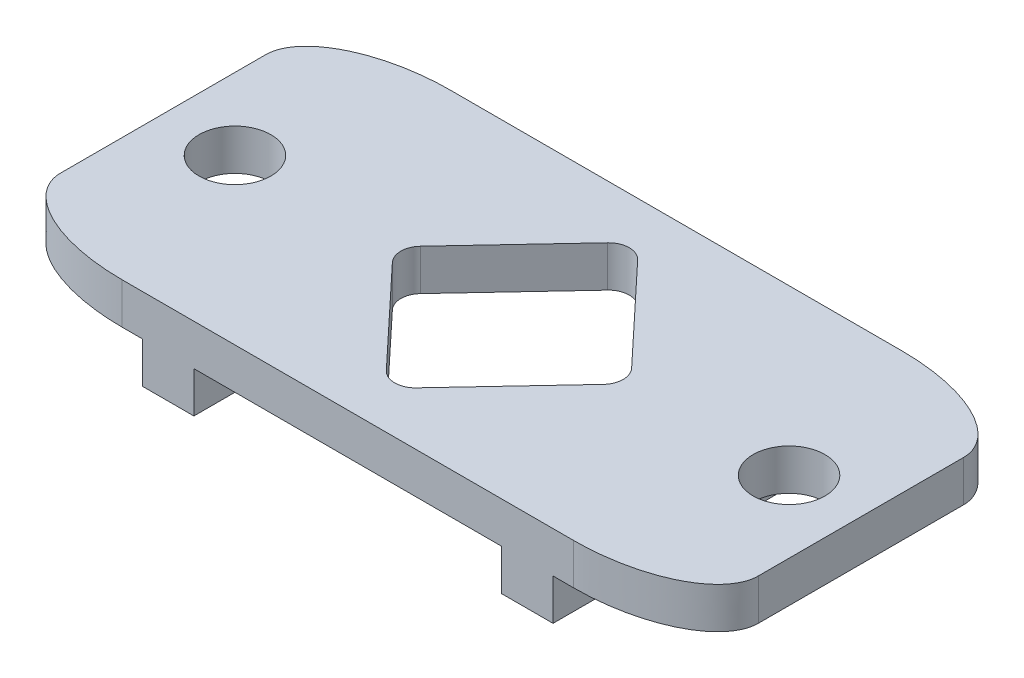
ISO-10303-21;
HEADER;
FILE_DESCRIPTION(('STEP AP214'),'2;1');
FILE_NAME('part.step','',(''),(''),'','','');
FILE_SCHEMA(('AUTOMOTIVE_DESIGN { 1 0 10303 214 1 1 1 1 }'));
ENDSEC;
DATA;
#1=APPLICATION_CONTEXT('core data for automotive mechanical design processes');
#2=APPLICATION_PROTOCOL_DEFINITION('international standard','automotive_design',2000,#1);
#3=PRODUCT_CONTEXT('',#1,'mechanical');
#4=PRODUCT('Part','Part','',(#3));
#5=PRODUCT_RELATED_PRODUCT_CATEGORY('part','',(#4));
#6=PRODUCT_DEFINITION_FORMATION('','',#4);
#7=PRODUCT_DEFINITION_CONTEXT('part definition',#1,'design');
#8=PRODUCT_DEFINITION('design','',#6,#7);
#9=PRODUCT_DEFINITION_SHAPE('','',#8);
#10=(LENGTH_UNIT() NAMED_UNIT(*) SI_UNIT(.MILLI.,.METRE.));
#11=(NAMED_UNIT(*) PLANE_ANGLE_UNIT() SI_UNIT($,.RADIAN.));
#12=(NAMED_UNIT(*) SI_UNIT($,.STERADIAN.) SOLID_ANGLE_UNIT());
#13=UNCERTAINTY_MEASURE_WITH_UNIT(LENGTH_MEASURE(1.E-05),#10,'distance_accuracy_value','');
#14=(GEOMETRIC_REPRESENTATION_CONTEXT(3) GLOBAL_UNCERTAINTY_ASSIGNED_CONTEXT((#13)) GLOBAL_UNIT_ASSIGNED_CONTEXT((#10,
#11,#12)) REPRESENTATION_CONTEXT('',''));
#15=CARTESIAN_POINT('',(0.,0.,0.));
#16=DIRECTION('',(0.,0.,1.));
#17=DIRECTION('',(1.,0.,0.));
#18=AXIS2_PLACEMENT_3D('',#15,#16,#17);
#19=CARTESIAN_POINT('',(0.,2.,0.));
#20=DIRECTION('',(0.,-1.,0.));
#21=DIRECTION('',(0.,0.,-1.));
#22=AXIS2_PLACEMENT_3D('',#19,#20,#21);
#23=PLANE('',#22);
#24=CARTESIAN_POINT('',(-13.5,2.,0.));
#25=DIRECTION('',(0.,1.,0.));
#26=DIRECTION('',(0.,0.,1.));
#27=AXIS2_PLACEMENT_3D('',#24,#25,#26);
#28=CIRCLE('',#27,1.75);
#29=CARTESIAN_POINT('',(-13.5,2.,1.75));
#30=VERTEX_POINT('',#29);
#31=EDGE_CURVE('E367',#30,#30,#28,.T.);
#32=ORIENTED_EDGE('',*,*,#31,.F.);
#33=EDGE_LOOP('',(#32));
#34=FACE_BOUND('',#33,.T.);
#35=DIRECTION('',(0.,0.,-1.));
#36=VECTOR('',#35,1.);
#37=CARTESIAN_POINT('',(17.,2.,8.));
#38=LINE('',#37,#36);
#39=CARTESIAN_POINT('',(17.,2.,5.));
#40=VERTEX_POINT('',#39);
#41=CARTESIAN_POINT('',(17.,2.,-5.));
#42=VERTEX_POINT('',#41);
#43=EDGE_CURVE('E625',#40,#42,#38,.T.);
#44=ORIENTED_EDGE('',*,*,#43,.T.);
#45=CARTESIAN_POINT('',(11.,2.,-8.));
#46=CARTESIAN_POINT('',(17.,2.,-8.));
#47=CARTESIAN_POINT('',(17.,2.,-5.));
#48=(BOUNDED_CURVE() B_SPLINE_CURVE(2,(#45,#46,#47),.UNSPECIFIED.,.F.,
.F.) B_SPLINE_CURVE_WITH_KNOTS((3,3),(0.,1.),
.UNSPECIFIED.) CURVE() GEOMETRIC_REPRESENTATION_ITEM() RATIONAL_B_SPLINE_CURVE((1.,
0.707106781186548,1.)) REPRESENTATION_ITEM(''));
#49=CARTESIAN_POINT('',(11.,2.,-8.));
#50=VERTEX_POINT('',#49);
#51=EDGE_CURVE('E711',#42,#50,#48,.F.);
#52=ORIENTED_EDGE('',*,*,#51,.T.);
#53=DIRECTION('',(1.,0.,0.));
#54=VECTOR('',#53,1.);
#55=CARTESIAN_POINT('',(-17.,2.,-8.));
#56=LINE('',#55,#54);
#57=CARTESIAN_POINT('',(-11.,2.,-8.));
#58=VERTEX_POINT('',#57);
#59=EDGE_CURVE('E381',#58,#50,#56,.T.);
#60=ORIENTED_EDGE('',*,*,#59,.F.);
#61=CARTESIAN_POINT('',(-17.,2.,-5.));
#62=CARTESIAN_POINT('',(-17.,2.,-8.));
#63=CARTESIAN_POINT('',(-11.,2.,-8.));
#64=(BOUNDED_CURVE() B_SPLINE_CURVE(2,(#61,#62,#63),.UNSPECIFIED.,.F.,
.F.) B_SPLINE_CURVE_WITH_KNOTS((3,3),(0.,1.),
.UNSPECIFIED.) CURVE() GEOMETRIC_REPRESENTATION_ITEM() RATIONAL_B_SPLINE_CURVE((1.,
0.707106781186548,1.)) REPRESENTATION_ITEM(''));
#65=CARTESIAN_POINT('',(-17.,2.,-5.));
#66=VERTEX_POINT('',#65);
#67=EDGE_CURVE('E564',#58,#66,#64,.F.);
#68=ORIENTED_EDGE('',*,*,#67,.T.);
#69=DIRECTION('',(0.,0.,-1.));
#70=VECTOR('',#69,1.);
#71=CARTESIAN_POINT('',(-17.,2.,8.));
#72=LINE('',#71,#70);
#73=CARTESIAN_POINT('',(-17.,2.,5.));
#74=VERTEX_POINT('',#73);
#75=EDGE_CURVE('E378',#74,#66,#72,.T.);
#76=ORIENTED_EDGE('',*,*,#75,.F.);
#77=CARTESIAN_POINT('',(-11.,2.,8.));
#78=CARTESIAN_POINT('',(-17.,2.,8.));
#79=CARTESIAN_POINT('',(-17.,2.,5.));
#80=(BOUNDED_CURVE() B_SPLINE_CURVE(2,(#77,#78,#79),.UNSPECIFIED.,.F.,
.F.) B_SPLINE_CURVE_WITH_KNOTS((3,3),(0.,1.),
.UNSPECIFIED.) CURVE() GEOMETRIC_REPRESENTATION_ITEM() RATIONAL_B_SPLINE_CURVE((1.,
0.707106781186548,1.)) REPRESENTATION_ITEM(''));
#81=CARTESIAN_POINT('',(-11.,2.,8.));
#82=VERTEX_POINT('',#81);
#83=EDGE_CURVE('E390',#74,#82,#80,.F.);
#84=ORIENTED_EDGE('',*,*,#83,.T.);
#85=DIRECTION('',(1.,0.,0.));
#86=VECTOR('',#85,1.);
#87=CARTESIAN_POINT('',(-17.,2.,8.));
#88=LINE('',#87,#86);
#89=CARTESIAN_POINT('',(11.,2.,8.));
#90=VERTEX_POINT('',#89);
#91=EDGE_CURVE('E383',#82,#90,#88,.T.);
#92=ORIENTED_EDGE('',*,*,#91,.T.);
#93=CARTESIAN_POINT('',(17.,2.,5.));
#94=CARTESIAN_POINT('',(17.,2.,8.));
#95=CARTESIAN_POINT('',(11.,2.,8.));
#96=(BOUNDED_CURVE() B_SPLINE_CURVE(2,(#93,#94,#95),.UNSPECIFIED.,.F.,
.F.) B_SPLINE_CURVE_WITH_KNOTS((3,3),(0.,1.),
.UNSPECIFIED.) CURVE() GEOMETRIC_REPRESENTATION_ITEM() RATIONAL_B_SPLINE_CURVE((1.,
0.707106781186548,1.)) REPRESENTATION_ITEM(''));
#97=EDGE_CURVE('E569',#90,#40,#96,.F.);
#98=ORIENTED_EDGE('',*,*,#97,.T.);
#99=EDGE_LOOP('',(#44,#52,#60,#68,#76,#84,#92,#98));
#100=FACE_BOUND('',#99,.T.);
#101=CARTESIAN_POINT('',(13.5,2.,0.));
#102=DIRECTION('',(0.,1.,0.));
#103=DIRECTION('',(0.,0.,1.));
#104=AXIS2_PLACEMENT_3D('',#101,#102,#103);
#105=CIRCLE('',#104,1.75);
#106=CARTESIAN_POINT('',(13.5,2.,1.74999999999999));
#107=VERTEX_POINT('',#106);
#108=EDGE_CURVE('E361',#107,#107,#105,.F.);
#109=ORIENTED_EDGE('',*,*,#108,.T.);
#110=EDGE_LOOP('',(#109));
#111=FACE_BOUND('',#110,.T.);
#112=CARTESIAN_POINT('',(-4.41585297195076,2.,0.));
#113=DIRECTION('',(0.,-1.,0.));
#114=DIRECTION('',(0.,0.,-1.));
#115=AXIS2_PLACEMENT_3D('',#112,#113,#114);
#116=CIRCLE('',#115,1.);
#117=CARTESIAN_POINT('',(-5.14539017609084,2.,-0.683941128881335));
#118=VERTEX_POINT('',#117);
#119=CARTESIAN_POINT('',(-5.14539017609084,2.,0.683941128881334));
#120=VERTEX_POINT('',#119);
#121=EDGE_CURVE('E238',#118,#120,#116,.F.);
#122=ORIENTED_EDGE('',*,*,#121,.F.);
#123=DIRECTION('',(0.68394112888133,0.,-0.729537204140085));
#124=VECTOR('',#123,1.);
#125=CARTESIAN_POINT('',(-3.07976248650889,2.,-2.88727733110208));
#126=LINE('',#125,#124);
#127=CARTESIAN_POINT('',(-0.729537204140099,2.,-5.39418429896213));
#128=VERTEX_POINT('',#127);
#129=EDGE_CURVE('E250',#118,#128,#126,.T.);
#130=ORIENTED_EDGE('',*,*,#129,.T.);
#131=CARTESIAN_POINT('',(0.,2.,-4.7102431700808));
#132=DIRECTION('',(0.,-1.,0.));
#133=DIRECTION('',(0.,0.,-1.));
#134=AXIS2_PLACEMENT_3D('',#131,#132,#133);
#135=CIRCLE('',#134,1.);
#136=CARTESIAN_POINT('',(0.729537204140084,2.,-5.39418429896213));
#137=VERTEX_POINT('',#136);
#138=EDGE_CURVE('E254',#128,#137,#135,.T.);
#139=ORIENTED_EDGE('',*,*,#138,.T.);
#140=DIRECTION('',(0.68394112888133,0.,0.729537204140085));
#141=VECTOR('',#140,1.);
#142=CARTESIAN_POINT('',(3.07976248650888,2.,-2.88727733110208));
#143=LINE('',#142,#141);
#144=CARTESIAN_POINT('',(5.14539017609083,2.,-0.683941128881334));
#145=VERTEX_POINT('',#144);
#146=EDGE_CURVE('E266',#137,#145,#143,.T.);
#147=ORIENTED_EDGE('',*,*,#146,.T.);
#148=CARTESIAN_POINT('',(4.41585297195075,2.,0.));
#149=DIRECTION('',(0.,-1.,0.));
#150=DIRECTION('',(0.,0.,-1.));
#151=AXIS2_PLACEMENT_3D('',#148,#149,#150);
#152=CIRCLE('',#151,1.);
#153=CARTESIAN_POINT('',(5.14539017609083,2.,0.683941128881335));
#154=VERTEX_POINT('',#153);
#155=EDGE_CURVE('E269',#154,#145,#152,.F.);
#156=ORIENTED_EDGE('',*,*,#155,.F.);
#157=DIRECTION('',(-0.68394112888133,0.,0.729537204140085));
#158=VECTOR('',#157,1.);
#159=CARTESIAN_POINT('',(3.07976248650888,2.,2.88727733110208));
#160=LINE('',#159,#158);
#161=CARTESIAN_POINT('',(0.729537204140084,2.,5.39418429896213));
#162=VERTEX_POINT('',#161);
#163=EDGE_CURVE('E271',#154,#162,#160,.T.);
#164=ORIENTED_EDGE('',*,*,#163,.T.);
#165=CARTESIAN_POINT('',(0.,2.,4.7102431700808));
#166=DIRECTION('',(0.,-1.,0.));
#167=DIRECTION('',(0.,0.,-1.));
#168=AXIS2_PLACEMENT_3D('',#165,#166,#167);
#169=CIRCLE('',#168,1.);
#170=CARTESIAN_POINT('',(-0.729537204140098,2.,5.39418429896213));
#171=VERTEX_POINT('',#170);
#172=EDGE_CURVE('E274',#171,#162,#169,.F.);
#173=ORIENTED_EDGE('',*,*,#172,.F.);
#174=DIRECTION('',(-0.68394112888133,0.,-0.729537204140085));
#175=VECTOR('',#174,1.);
#176=CARTESIAN_POINT('',(-3.07976248650889,2.,2.88727733110208));
#177=LINE('',#176,#175);
#178=EDGE_CURVE('E246',#171,#120,#177,.T.);
#179=ORIENTED_EDGE('',*,*,#178,.T.);
#180=EDGE_LOOP('',(#122,#130,#139,#147,#156,#164,#173,#179));
#181=FACE_BOUND('',#180,.T.);
#182=ADVANCED_FACE('F68',(#34,#100,#111,#181),#23,.F.);
#183=CARTESIAN_POINT('',(0.,0.,0.));
#184=DIRECTION('',(0.,-1.,0.));
#185=DIRECTION('',(0.,0.,-1.));
#186=AXIS2_PLACEMENT_3D('',#183,#184,#185);
#187=PLANE('',#186);
#188=DIRECTION('',(0.,0.,1.));
#189=VECTOR('',#188,1.);
#190=CARTESIAN_POINT('',(7.49999999999999,0.,0.));
#191=LINE('',#190,#189);
#192=CARTESIAN_POINT('',(7.49999999999999,0.,-8.));
#193=VERTEX_POINT('',#192);
#194=CARTESIAN_POINT('',(7.49999999999999,0.,8.));
#195=VERTEX_POINT('',#194);
#196=EDGE_CURVE('E311',#193,#195,#191,.T.);
#197=ORIENTED_EDGE('',*,*,#196,.T.);
#198=DIRECTION('',(1.,0.,0.));
#199=VECTOR('',#198,1.);
#200=CARTESIAN_POINT('',(-17.,0.,8.));
#201=LINE('',#200,#199);
#202=CARTESIAN_POINT('',(-7.50000000000001,0.,8.));
#203=VERTEX_POINT('',#202);
#204=EDGE_CURVE('E618',#203,#195,#201,.T.);
#205=ORIENTED_EDGE('',*,*,#204,.F.);
#206=DIRECTION('',(0.,0.,1.));
#207=VECTOR('',#206,1.);
#208=CARTESIAN_POINT('',(-7.50000000000001,0.,0.));
#209=LINE('',#208,#207);
#210=CARTESIAN_POINT('',(-7.50000000000001,0.,-8.));
#211=VERTEX_POINT('',#210);
#212=EDGE_CURVE('E326',#211,#203,#209,.T.);
#213=ORIENTED_EDGE('',*,*,#212,.F.);
#214=DIRECTION('',(1.,0.,0.));
#215=VECTOR('',#214,1.);
#216=CARTESIAN_POINT('',(-17.,0.,-8.));
#217=LINE('',#216,#215);
#218=EDGE_CURVE('E609',#211,#193,#217,.T.);
#219=ORIENTED_EDGE('',*,*,#218,.T.);
#220=EDGE_LOOP('',(#197,#205,#213,#219));
#221=FACE_BOUND('',#220,.T.);
#222=DIRECTION('',(0.68394112888133,0.,-0.729537204140085));
#223=VECTOR('',#222,1.);
#224=CARTESIAN_POINT('',(-3.07976248650889,0.,-2.88727733110208));
#225=LINE('',#224,#223);
#226=CARTESIAN_POINT('',(-5.14539017609084,0.,-0.683941128881335));
#227=VERTEX_POINT('',#226);
#228=CARTESIAN_POINT('',(-0.729537204140099,0.,-5.39418429896213));
#229=VERTEX_POINT('',#228);
#230=EDGE_CURVE('E278',#227,#229,#225,.T.);
#231=ORIENTED_EDGE('',*,*,#230,.F.);
#232=CARTESIAN_POINT('',(-4.41585297195076,0.,0.));
#233=DIRECTION('',(0.,-1.,0.));
#234=DIRECTION('',(0.,0.,-1.));
#235=AXIS2_PLACEMENT_3D('',#232,#233,#234);
#236=CIRCLE('',#235,1.);
#237=CARTESIAN_POINT('',(-5.14539017609084,0.,0.683941128881334));
#238=VERTEX_POINT('',#237);
#239=EDGE_CURVE('E241',#227,#238,#236,.F.);
#240=ORIENTED_EDGE('',*,*,#239,.T.);
#241=DIRECTION('',(-0.68394112888133,0.,-0.729537204140085));
#242=VECTOR('',#241,1.);
#243=CARTESIAN_POINT('',(-3.07976248650889,0.,2.88727733110208));
#244=LINE('',#243,#242);
#245=CARTESIAN_POINT('',(-0.729537204140098,0.,5.39418429896213));
#246=VERTEX_POINT('',#245);
#247=EDGE_CURVE('E259',#246,#238,#244,.T.);
#248=ORIENTED_EDGE('',*,*,#247,.F.);
#249=CARTESIAN_POINT('',(0.,0.,4.7102431700808));
#250=DIRECTION('',(0.,-1.,0.));
#251=DIRECTION('',(0.,0.,-1.));
#252=AXIS2_PLACEMENT_3D('',#249,#250,#251);
#253=CIRCLE('',#252,1.);
#254=CARTESIAN_POINT('',(0.729537204140084,0.,5.39418429896213));
#255=VERTEX_POINT('',#254);
#256=EDGE_CURVE('E262',#246,#255,#253,.F.);
#257=ORIENTED_EDGE('',*,*,#256,.T.);
#258=DIRECTION('',(-0.68394112888133,0.,0.729537204140085));
#259=VECTOR('',#258,1.);
#260=CARTESIAN_POINT('',(3.07976248650888,0.,2.88727733110208));
#261=LINE('',#260,#259);
#262=CARTESIAN_POINT('',(5.14539017609083,0.,0.683941128881335));
#263=VERTEX_POINT('',#262);
#264=EDGE_CURVE('E289',#263,#255,#261,.T.);
#265=ORIENTED_EDGE('',*,*,#264,.F.);
#266=CARTESIAN_POINT('',(4.41585297195075,0.,0.));
#267=DIRECTION('',(0.,-1.,0.));
#268=DIRECTION('',(0.,0.,-1.));
#269=AXIS2_PLACEMENT_3D('',#266,#267,#268);
#270=CIRCLE('',#269,1.);
#271=CARTESIAN_POINT('',(5.14539017609083,0.,-0.683941128881334));
#272=VERTEX_POINT('',#271);
#273=EDGE_CURVE('E286',#263,#272,#270,.F.);
#274=ORIENTED_EDGE('',*,*,#273,.T.);
#275=DIRECTION('',(0.68394112888133,0.,0.729537204140085));
#276=VECTOR('',#275,1.);
#277=CARTESIAN_POINT('',(3.07976248650888,0.,-2.88727733110208));
#278=LINE('',#277,#276);
#279=CARTESIAN_POINT('',(0.729537204140084,0.,-5.39418429896213));
#280=VERTEX_POINT('',#279);
#281=EDGE_CURVE('E283',#280,#272,#278,.T.);
#282=ORIENTED_EDGE('',*,*,#281,.F.);
#283=CARTESIAN_POINT('',(0.,0.,-4.7102431700808));
#284=DIRECTION('',(0.,-1.,0.));
#285=DIRECTION('',(0.,0.,-1.));
#286=AXIS2_PLACEMENT_3D('',#283,#284,#285);
#287=CIRCLE('',#286,1.);
#288=EDGE_CURVE('E280',#229,#280,#287,.T.);
#289=ORIENTED_EDGE('',*,*,#288,.F.);
#290=EDGE_LOOP('',(#231,#240,#248,#257,#265,#274,#282,#289));
#291=FACE_BOUND('',#290,.T.);
#292=ADVANCED_FACE('F406',(#221,#291),#187,.T.);
#293=CARTESIAN_POINT('',(13.5,0.,0.));
#294=DIRECTION('',(0.,1.,0.));
#295=DIRECTION('',(0.,0.,1.));
#296=AXIS2_PLACEMENT_3D('',#293,#294,#295);
#297=CIRCLE('',#296,1.75);
#298=CARTESIAN_POINT('',(13.5,0.,1.74999999999999));
#299=VERTEX_POINT('',#298);
#300=EDGE_CURVE('E353',#299,#299,#297,.F.);
#301=ORIENTED_EDGE('',*,*,#300,.F.);
#302=EDGE_LOOP('',(#301));
#303=FACE_BOUND('',#302,.T.);
#304=CARTESIAN_POINT('',(9.99999999999999,0.,-8.));
#305=VERTEX_POINT('',#304);
#306=CARTESIAN_POINT('',(11.,0.,-8.));
#307=VERTEX_POINT('',#306);
#308=EDGE_CURVE('E601',#305,#307,#217,.T.);
#309=ORIENTED_EDGE('',*,*,#308,.T.);
#310=CARTESIAN_POINT('',(17.,0.,-5.));
#311=CARTESIAN_POINT('',(17.,0.,-8.));
#312=CARTESIAN_POINT('',(11.,0.,-8.));
#313=(BOUNDED_CURVE() B_SPLINE_CURVE(2,(#310,#311,#312),.UNSPECIFIED.,.F.,
.F.) B_SPLINE_CURVE_WITH_KNOTS((3,3),(0.,1.),
.UNSPECIFIED.) CURVE() GEOMETRIC_REPRESENTATION_ITEM() RATIONAL_B_SPLINE_CURVE((1.,
0.707106781186548,1.)) REPRESENTATION_ITEM(''));
#314=CARTESIAN_POINT('',(17.,0.,-5.));
#315=VERTEX_POINT('',#314);
#316=EDGE_CURVE('E478',#307,#315,#313,.F.);
#317=ORIENTED_EDGE('',*,*,#316,.T.);
#318=DIRECTION('',(0.,0.,-1.));
#319=VECTOR('',#318,1.);
#320=CARTESIAN_POINT('',(17.,0.,8.));
#321=LINE('',#320,#319);
#322=CARTESIAN_POINT('',(17.,0.,5.));
#323=VERTEX_POINT('',#322);
#324=EDGE_CURVE('E621',#323,#315,#321,.T.);
#325=ORIENTED_EDGE('',*,*,#324,.F.);
#326=CARTESIAN_POINT('',(11.,0.,8.));
#327=CARTESIAN_POINT('',(17.,0.,8.));
#328=CARTESIAN_POINT('',(17.,0.,5.));
#329=(BOUNDED_CURVE() B_SPLINE_CURVE(2,(#326,#327,#328),.UNSPECIFIED.,.F.,
.F.) B_SPLINE_CURVE_WITH_KNOTS((3,3),(0.,1.),
.UNSPECIFIED.) CURVE() GEOMETRIC_REPRESENTATION_ITEM() RATIONAL_B_SPLINE_CURVE((1.,
0.707106781186548,1.)) REPRESENTATION_ITEM(''));
#330=CARTESIAN_POINT('',(11.,0.,8.));
#331=VERTEX_POINT('',#330);
#332=EDGE_CURVE('E732',#323,#331,#329,.F.);
#333=ORIENTED_EDGE('',*,*,#332,.T.);
#334=CARTESIAN_POINT('',(9.99999999999999,0.,8.));
#335=VERTEX_POINT('',#334);
#336=EDGE_CURVE('E624',#335,#331,#201,.T.);
#337=ORIENTED_EDGE('',*,*,#336,.F.);
#338=DIRECTION('',(0.,0.,1.));
#339=VECTOR('',#338,1.);
#340=CARTESIAN_POINT('',(9.99999999999999,0.,0.));
#341=LINE('',#340,#339);
#342=EDGE_CURVE('E296',#305,#335,#341,.T.);
#343=ORIENTED_EDGE('',*,*,#342,.F.);
#344=EDGE_LOOP('',(#309,#317,#325,#333,#337,#343));
#345=FACE_BOUND('',#344,.T.);
#346=ADVANCED_FACE('F675',(#303,#345),#187,.T.);
#347=CARTESIAN_POINT('',(-13.5,0.,0.));
#348=DIRECTION('',(0.,1.,0.));
#349=DIRECTION('',(0.,0.,1.));
#350=AXIS2_PLACEMENT_3D('',#347,#348,#349);
#351=CIRCLE('',#350,1.75);
#352=CARTESIAN_POINT('',(-13.5,0.,1.75));
#353=VERTEX_POINT('',#352);
#354=EDGE_CURVE('E364',#353,#353,#351,.T.);
#355=ORIENTED_EDGE('',*,*,#354,.T.);
#356=EDGE_LOOP('',(#355));
#357=FACE_BOUND('',#356,.T.);
#358=CARTESIAN_POINT('',(-11.,0.,8.));
#359=VERTEX_POINT('',#358);
#360=CARTESIAN_POINT('',(-10.,0.,8.));
#361=VERTEX_POINT('',#360);
#362=EDGE_CURVE('E382',#359,#361,#201,.T.);
#363=ORIENTED_EDGE('',*,*,#362,.F.);
#364=CARTESIAN_POINT('',(-17.,0.,5.));
#365=CARTESIAN_POINT('',(-17.,0.,8.));
#366=CARTESIAN_POINT('',(-11.,0.,8.));
#367=(BOUNDED_CURVE() B_SPLINE_CURVE(2,(#364,#365,#366),.UNSPECIFIED.,.F.,
.F.) B_SPLINE_CURVE_WITH_KNOTS((3,3),(0.,1.),
.UNSPECIFIED.) CURVE() GEOMETRIC_REPRESENTATION_ITEM() RATIONAL_B_SPLINE_CURVE((1.,
0.707106781186548,1.)) REPRESENTATION_ITEM(''));
#368=CARTESIAN_POINT('',(-17.,0.,5.));
#369=VERTEX_POINT('',#368);
#370=EDGE_CURVE('E82',#359,#369,#367,.F.);
#371=ORIENTED_EDGE('',*,*,#370,.T.);
#372=DIRECTION('',(0.,0.,-1.));
#373=VECTOR('',#372,1.);
#374=CARTESIAN_POINT('',(-17.,0.,8.));
#375=LINE('',#374,#373);
#376=CARTESIAN_POINT('',(-17.,0.,-5.));
#377=VERTEX_POINT('',#376);
#378=EDGE_CURVE('E370',#369,#377,#375,.T.);
#379=ORIENTED_EDGE('',*,*,#378,.T.);
#380=CARTESIAN_POINT('',(-11.,0.,-8.));
#381=CARTESIAN_POINT('',(-17.,0.,-8.));
#382=CARTESIAN_POINT('',(-17.,0.,-5.));
#383=(BOUNDED_CURVE() B_SPLINE_CURVE(2,(#380,#381,#382),.UNSPECIFIED.,.F.,
.F.) B_SPLINE_CURVE_WITH_KNOTS((3,3),(0.,1.),
.UNSPECIFIED.) CURVE() GEOMETRIC_REPRESENTATION_ITEM() RATIONAL_B_SPLINE_CURVE((1.,
0.707106781186548,1.)) REPRESENTATION_ITEM(''));
#384=CARTESIAN_POINT('',(-11.,0.,-8.));
#385=VERTEX_POINT('',#384);
#386=EDGE_CURVE('E574',#377,#385,#383,.F.);
#387=ORIENTED_EDGE('',*,*,#386,.T.);
#388=CARTESIAN_POINT('',(-10.,0.,-8.));
#389=VERTEX_POINT('',#388);
#390=EDGE_CURVE('E438',#385,#389,#217,.T.);
#391=ORIENTED_EDGE('',*,*,#390,.T.);
#392=DIRECTION('',(0.,0.,1.));
#393=VECTOR('',#392,1.);
#394=CARTESIAN_POINT('',(-10.,0.,0.));
#395=LINE('',#394,#393);
#396=EDGE_CURVE('E338',#389,#361,#395,.T.);
#397=ORIENTED_EDGE('',*,*,#396,.T.);
#398=EDGE_LOOP('',(#363,#371,#379,#387,#391,#397));
#399=FACE_BOUND('',#398,.T.);
#400=ADVANCED_FACE('F452',(#357,#399),#187,.T.);
#401=CARTESIAN_POINT('',(-17.,2.,8.));
#402=DIRECTION('',(-1.,0.,0.));
#403=DIRECTION('',(0.,0.,1.));
#404=AXIS2_PLACEMENT_3D('',#401,#402,#403);
#405=PLANE('',#404);
#406=ORIENTED_EDGE('',*,*,#378,.F.);
#407=CARTESIAN_POINT('',(-17.,2.1,5.));
#408=CARTESIAN_POINT('',(-17.,1.36666666666667,5.));
#409=CARTESIAN_POINT('',(-17.,0.633333333333334,5.));
#410=CARTESIAN_POINT('',(-17.,-0.0999999999999998,5.));
#411=(BOUNDED_CURVE() B_SPLINE_CURVE(3,(#407,#408,#409,#410),.UNSPECIFIED.,.F.,
.F.) B_SPLINE_CURVE_WITH_KNOTS((4,4),(-0.0021,9.99999999999998E-05),
.UNSPECIFIED.) CURVE() GEOMETRIC_REPRESENTATION_ITEM() RATIONAL_B_SPLINE_CURVE((1.,1.,1.,1.)) REPRESENTATION_ITEM(''));
#412=EDGE_CURVE('E13',#369,#74,#411,.F.);
#413=ORIENTED_EDGE('',*,*,#412,.T.);
#414=ORIENTED_EDGE('',*,*,#75,.T.);
#415=CARTESIAN_POINT('',(-17.,-0.1,-5.));
#416=CARTESIAN_POINT('',(-17.,0.633333333333333,-5.));
#417=CARTESIAN_POINT('',(-17.,1.36666666666667,-5.));
#418=CARTESIAN_POINT('',(-17.,2.1,-5.));
#419=(BOUNDED_CURVE() B_SPLINE_CURVE(3,(#415,#416,#417,#418),.UNSPECIFIED.,.F.,
.F.) B_SPLINE_CURVE_WITH_KNOTS((4,4),(-9.99999999999998E-05,0.0021),
.UNSPECIFIED.) CURVE() GEOMETRIC_REPRESENTATION_ITEM() RATIONAL_B_SPLINE_CURVE((1.,1.,1.,1.)) REPRESENTATION_ITEM(''));
#420=EDGE_CURVE('E433',#66,#377,#419,.F.);
#421=ORIENTED_EDGE('',*,*,#420,.T.);
#422=EDGE_LOOP('',(#406,#413,#414,#421));
#423=FACE_BOUND('',#422,.T.);
#424=ADVANCED_FACE('F441',(#423),#405,.T.);
#425=CARTESIAN_POINT('',(-17.,2.,8.));
#426=DIRECTION('',(0.,0.,-1.));
#427=DIRECTION('',(-1.,0.,0.));
#428=AXIS2_PLACEMENT_3D('',#425,#426,#427);
#429=PLANE('',#428);
#430=ORIENTED_EDGE('',*,*,#91,.F.);
#431=CARTESIAN_POINT('',(-11.,-0.0999999999999998,8.));
#432=CARTESIAN_POINT('',(-11.,0.633333333333334,8.));
#433=CARTESIAN_POINT('',(-11.,1.36666666666667,8.));
#434=CARTESIAN_POINT('',(-11.,2.1,8.));
#435=(BOUNDED_CURVE() B_SPLINE_CURVE(3,(#431,#432,#433,#434),.UNSPECIFIED.,.F.,
.F.) B_SPLINE_CURVE_WITH_KNOTS((4,4),(-0.0021,0.0001),
.UNSPECIFIED.) CURVE() GEOMETRIC_REPRESENTATION_ITEM() RATIONAL_B_SPLINE_CURVE((1.,1.,1.,1.)) REPRESENTATION_ITEM(''));
#436=EDGE_CURVE('E542',#82,#359,#435,.F.);
#437=ORIENTED_EDGE('',*,*,#436,.T.);
#438=ORIENTED_EDGE('',*,*,#362,.T.);
#439=DIRECTION('',(0.,1.,0.));
#440=VECTOR('',#439,1.);
#441=CARTESIAN_POINT('',(-10.,-2.,8.));
#442=LINE('',#441,#440);
#443=CARTESIAN_POINT('',(-10.,-2.,8.));
#444=VERTEX_POINT('',#443);
#445=EDGE_CURVE('E354',#444,#361,#442,.T.);
#446=ORIENTED_EDGE('',*,*,#445,.F.);
#447=DIRECTION('',(1.,0.,0.));
#448=VECTOR('',#447,1.);
#449=CARTESIAN_POINT('',(0.,-2.,8.));
#450=LINE('',#449,#448);
#451=CARTESIAN_POINT('',(-7.50000000000001,-2.,8.));
#452=VERTEX_POINT('',#451);
#453=EDGE_CURVE('E343',#444,#452,#450,.T.);
#454=ORIENTED_EDGE('',*,*,#453,.T.);
#455=DIRECTION('',(0.,1.,0.));
#456=VECTOR('',#455,1.);
#457=CARTESIAN_POINT('',(-7.50000000000001,-2.,8.));
#458=LINE('',#457,#456);
#459=EDGE_CURVE('E351',#452,#203,#458,.T.);
#460=ORIENTED_EDGE('',*,*,#459,.T.);
#461=ORIENTED_EDGE('',*,*,#204,.T.);
#462=DIRECTION('',(0.,1.,0.));
#463=VECTOR('',#462,1.);
#464=CARTESIAN_POINT('',(7.49999999999999,-2.,8.));
#465=LINE('',#464,#463);
#466=CARTESIAN_POINT('',(7.49999999999999,-2.,8.));
#467=VERTEX_POINT('',#466);
#468=EDGE_CURVE('E327',#467,#195,#465,.T.);
#469=ORIENTED_EDGE('',*,*,#468,.F.);
#470=DIRECTION('',(1.,0.,0.));
#471=VECTOR('',#470,1.);
#472=CARTESIAN_POINT('',(0.,-2.,8.));
#473=LINE('',#472,#471);
#474=CARTESIAN_POINT('',(9.99999999999999,-2.,8.));
#475=VERTEX_POINT('',#474);
#476=EDGE_CURVE('E316',#467,#475,#473,.T.);
#477=ORIENTED_EDGE('',*,*,#476,.T.);
#478=DIRECTION('',(0.,1.,0.));
#479=VECTOR('',#478,1.);
#480=CARTESIAN_POINT('',(9.99999999999999,-2.,8.));
#481=LINE('',#480,#479);
#482=EDGE_CURVE('E323',#475,#335,#481,.T.);
#483=ORIENTED_EDGE('',*,*,#482,.T.);
#484=ORIENTED_EDGE('',*,*,#336,.T.);
#485=CARTESIAN_POINT('',(11.,2.1,8.));
#486=CARTESIAN_POINT('',(11.,1.36666666666667,8.));
#487=CARTESIAN_POINT('',(11.,0.633333333333333,8.));
#488=CARTESIAN_POINT('',(11.,-0.1,8.));
#489=(BOUNDED_CURVE() B_SPLINE_CURVE(3,(#485,#486,#487,#488),.UNSPECIFIED.,.F.,
.F.) B_SPLINE_CURVE_WITH_KNOTS((4,4),(-0.0001,0.0021),
.UNSPECIFIED.) CURVE() GEOMETRIC_REPRESENTATION_ITEM() RATIONAL_B_SPLINE_CURVE((1.,1.,1.,1.)) REPRESENTATION_ITEM(''));
#490=EDGE_CURVE('E570',#331,#90,#489,.F.);
#491=ORIENTED_EDGE('',*,*,#490,.T.);
#492=EDGE_LOOP('',(#430,#437,#438,#446,#454,#460,#461,#469,#477,#483,#484,#491));
#493=FACE_BOUND('',#492,.T.);
#494=ADVANCED_FACE('F451',(#493),#429,.F.);
#495=CARTESIAN_POINT('',(17.,2.,8.));
#496=DIRECTION('',(-1.,0.,0.));
#497=DIRECTION('',(0.,0.,1.));
#498=AXIS2_PLACEMENT_3D('',#495,#496,#497);
#499=PLANE('',#498);
#500=ORIENTED_EDGE('',*,*,#324,.T.);
#501=CARTESIAN_POINT('',(17.,2.1,-5.));
#502=CARTESIAN_POINT('',(17.,1.36666666666667,-5.));
#503=CARTESIAN_POINT('',(17.,0.633333333333334,-5.));
#504=CARTESIAN_POINT('',(17.,-0.0999999999999998,-5.));
#505=(BOUNDED_CURVE() B_SPLINE_CURVE(3,(#501,#502,#503,#504),.UNSPECIFIED.,.F.,
.F.) B_SPLINE_CURVE_WITH_KNOTS((4,4),(-0.0021,9.99999999999998E-05),
.UNSPECIFIED.) CURVE() GEOMETRIC_REPRESENTATION_ITEM() RATIONAL_B_SPLINE_CURVE((1.,1.,1.,1.)) REPRESENTATION_ITEM(''));
#506=EDGE_CURVE('E524',#315,#42,#505,.F.);
#507=ORIENTED_EDGE('',*,*,#506,.T.);
#508=ORIENTED_EDGE('',*,*,#43,.F.);
#509=CARTESIAN_POINT('',(17.,-0.1,5.));
#510=CARTESIAN_POINT('',(17.,0.633333333333333,5.));
#511=CARTESIAN_POINT('',(17.,1.36666666666667,5.));
#512=CARTESIAN_POINT('',(17.,2.1,5.));
#513=(BOUNDED_CURVE() B_SPLINE_CURVE(3,(#509,#510,#511,#512),.UNSPECIFIED.,.F.,
.F.) B_SPLINE_CURVE_WITH_KNOTS((4,4),(-9.99999999999998E-05,0.0021),
.UNSPECIFIED.) CURVE() GEOMETRIC_REPRESENTATION_ITEM() RATIONAL_B_SPLINE_CURVE((1.,1.,1.,1.)) REPRESENTATION_ITEM(''));
#514=EDGE_CURVE('E634',#40,#323,#513,.F.);
#515=ORIENTED_EDGE('',*,*,#514,.T.);
#516=EDGE_LOOP('',(#500,#507,#508,#515));
#517=FACE_BOUND('',#516,.T.);
#518=ADVANCED_FACE('F640',(#517),#499,.F.);
#519=CARTESIAN_POINT('',(-17.,2.,-8.));
#520=DIRECTION('',(0.,0.,-1.));
#521=DIRECTION('',(-1.,0.,0.));
#522=AXIS2_PLACEMENT_3D('',#519,#520,#521);
#523=PLANE('',#522);
#524=ORIENTED_EDGE('',*,*,#59,.T.);
#525=CARTESIAN_POINT('',(11.,-0.0999999999999998,-8.));
#526=CARTESIAN_POINT('',(11.,0.633333333333334,-8.));
#527=CARTESIAN_POINT('',(11.,1.36666666666667,-8.));
#528=CARTESIAN_POINT('',(11.,2.1,-8.));
#529=(BOUNDED_CURVE() B_SPLINE_CURVE(3,(#525,#526,#527,#528),.UNSPECIFIED.,.F.,
.F.) B_SPLINE_CURVE_WITH_KNOTS((4,4),(-0.0021,0.0001),
.UNSPECIFIED.) CURVE() GEOMETRIC_REPRESENTATION_ITEM() RATIONAL_B_SPLINE_CURVE((1.,1.,1.,1.)) REPRESENTATION_ITEM(''));
#530=EDGE_CURVE('E677',#50,#307,#529,.F.);
#531=ORIENTED_EDGE('',*,*,#530,.T.);
#532=ORIENTED_EDGE('',*,*,#308,.F.);
#533=DIRECTION('',(0.,1.,0.));
#534=VECTOR('',#533,1.);
#535=CARTESIAN_POINT('',(9.99999999999999,-2.,-8.));
#536=LINE('',#535,#534);
#537=CARTESIAN_POINT('',(9.99999999999999,-2.,-8.));
#538=VERTEX_POINT('',#537);
#539=EDGE_CURVE('E319',#538,#305,#536,.T.);
#540=ORIENTED_EDGE('',*,*,#539,.F.);
#541=DIRECTION('',(1.,0.,0.));
#542=VECTOR('',#541,1.);
#543=CARTESIAN_POINT('',(0.,-2.,-8.));
#544=LINE('',#543,#542);
#545=CARTESIAN_POINT('',(7.49999999999999,-2.,-8.));
#546=VERTEX_POINT('',#545);
#547=EDGE_CURVE('E310',#546,#538,#544,.T.);
#548=ORIENTED_EDGE('',*,*,#547,.F.);
#549=DIRECTION('',(0.,1.,0.));
#550=VECTOR('',#549,1.);
#551=CARTESIAN_POINT('',(7.49999999999999,-2.,-8.));
#552=LINE('',#551,#550);
#553=EDGE_CURVE('E330',#546,#193,#552,.T.);
#554=ORIENTED_EDGE('',*,*,#553,.T.);
#555=ORIENTED_EDGE('',*,*,#218,.F.);
#556=DIRECTION('',(0.,1.,0.));
#557=VECTOR('',#556,1.);
#558=CARTESIAN_POINT('',(-7.50000000000001,-2.,-8.));
#559=LINE('',#558,#557);
#560=CARTESIAN_POINT('',(-7.50000000000001,-2.,-8.));
#561=VERTEX_POINT('',#560);
#562=EDGE_CURVE('E346',#561,#211,#559,.T.);
#563=ORIENTED_EDGE('',*,*,#562,.F.);
#564=DIRECTION('',(1.,0.,0.));
#565=VECTOR('',#564,1.);
#566=CARTESIAN_POINT('',(0.,-2.,-8.));
#567=LINE('',#566,#565);
#568=CARTESIAN_POINT('',(-10.,-2.,-8.));
#569=VERTEX_POINT('',#568);
#570=EDGE_CURVE('E337',#569,#561,#567,.T.);
#571=ORIENTED_EDGE('',*,*,#570,.F.);
#572=DIRECTION('',(0.,1.,0.));
#573=VECTOR('',#572,1.);
#574=CARTESIAN_POINT('',(-10.,-2.,-8.));
#575=LINE('',#574,#573);
#576=EDGE_CURVE('E357',#569,#389,#575,.T.);
#577=ORIENTED_EDGE('',*,*,#576,.T.);
#578=ORIENTED_EDGE('',*,*,#390,.F.);
#579=CARTESIAN_POINT('',(-11.,2.1,-8.));
#580=CARTESIAN_POINT('',(-11.,1.36666666666667,-8.));
#581=CARTESIAN_POINT('',(-11.,0.633333333333333,-8.));
#582=CARTESIAN_POINT('',(-11.,-0.1,-8.));
#583=(BOUNDED_CURVE() B_SPLINE_CURVE(3,(#579,#580,#581,#582),.UNSPECIFIED.,.F.,
.F.) B_SPLINE_CURVE_WITH_KNOTS((4,4),(-0.0001,0.0021),
.UNSPECIFIED.) CURVE() GEOMETRIC_REPRESENTATION_ITEM() RATIONAL_B_SPLINE_CURVE((1.,1.,1.,1.)) REPRESENTATION_ITEM(''));
#584=EDGE_CURVE('E597',#385,#58,#583,.F.);
#585=ORIENTED_EDGE('',*,*,#584,.T.);
#586=EDGE_LOOP('',(#524,#531,#532,#540,#548,#554,#555,#563,#571,#577,#578,#585));
#587=FACE_BOUND('',#586,.T.);
#588=ADVANCED_FACE('F453',(#587),#523,.T.);
#589=CARTESIAN_POINT('',(-13.5,2.,0.));
#590=DIRECTION('',(0.,-1.,0.));
#591=DIRECTION('',(0.,0.,-1.));
#592=AXIS2_PLACEMENT_3D('',#589,#590,#591);
#593=CYLINDRICAL_SURFACE('',#592,1.75);
#594=ORIENTED_EDGE('',*,*,#31,.T.);
#595=EDGE_LOOP('',(#594));
#596=FACE_BOUND('',#595,.T.);
#597=ORIENTED_EDGE('',*,*,#354,.F.);
#598=EDGE_LOOP('',(#597));
#599=FACE_BOUND('',#598,.T.);
#600=ADVANCED_FACE('F408',(#596,#599),#593,.F.);
#601=CARTESIAN_POINT('',(13.5,2.,0.));
#602=DIRECTION('',(0.,-1.,0.));
#603=DIRECTION('',(0.,0.,-1.));
#604=AXIS2_PLACEMENT_3D('',#601,#602,#603);
#605=CYLINDRICAL_SURFACE('',#604,1.75);
#606=ORIENTED_EDGE('',*,*,#108,.F.);
#607=EDGE_LOOP('',(#606));
#608=FACE_BOUND('',#607,.T.);
#609=ORIENTED_EDGE('',*,*,#300,.T.);
#610=EDGE_LOOP('',(#609));
#611=FACE_BOUND('',#610,.T.);
#612=ADVANCED_FACE('F824',(#608,#611),#605,.F.);
#613=CARTESIAN_POINT('',(-7.50000000000001,-2.,0.));
#614=DIRECTION('',(-1.,0.,0.));
#615=DIRECTION('',(0.,0.,1.));
#616=AXIS2_PLACEMENT_3D('',#613,#614,#615);
#617=PLANE('',#616);
#618=ORIENTED_EDGE('',*,*,#212,.T.);
#619=ORIENTED_EDGE('',*,*,#459,.F.);
#620=DIRECTION('',(0.,0.,1.));
#621=VECTOR('',#620,1.);
#622=CARTESIAN_POINT('',(-7.50000000000001,-2.,0.));
#623=LINE('',#622,#621);
#624=EDGE_CURVE('E335',#561,#452,#623,.T.);
#625=ORIENTED_EDGE('',*,*,#624,.F.);
#626=ORIENTED_EDGE('',*,*,#562,.T.);
#627=EDGE_LOOP('',(#618,#619,#625,#626));
#628=FACE_BOUND('',#627,.T.);
#629=ADVANCED_FACE('F822',(#628),#617,.F.);
#630=CARTESIAN_POINT('',(-10.,-2.,0.));
#631=DIRECTION('',(-1.,0.,0.));
#632=DIRECTION('',(0.,0.,1.));
#633=AXIS2_PLACEMENT_3D('',#630,#631,#632);
#634=PLANE('',#633);
#635=ORIENTED_EDGE('',*,*,#396,.F.);
#636=ORIENTED_EDGE('',*,*,#576,.F.);
#637=DIRECTION('',(0.,0.,1.));
#638=VECTOR('',#637,1.);
#639=CARTESIAN_POINT('',(-10.,-2.,0.));
#640=LINE('',#639,#638);
#641=EDGE_CURVE('E340',#569,#444,#640,.T.);
#642=ORIENTED_EDGE('',*,*,#641,.T.);
#643=ORIENTED_EDGE('',*,*,#445,.T.);
#644=EDGE_LOOP('',(#635,#636,#642,#643));
#645=FACE_BOUND('',#644,.T.);
#646=ADVANCED_FACE('F687',(#645),#634,.T.);
#647=CARTESIAN_POINT('',(0.,-2.,0.));
#648=DIRECTION('',(0.,1.,0.));
#649=DIRECTION('',(0.,0.,1.));
#650=AXIS2_PLACEMENT_3D('',#647,#648,#649);
#651=PLANE('',#650);
#652=ORIENTED_EDGE('',*,*,#624,.T.);
#653=ORIENTED_EDGE('',*,*,#453,.F.);
#654=ORIENTED_EDGE('',*,*,#641,.F.);
#655=ORIENTED_EDGE('',*,*,#570,.T.);
#656=EDGE_LOOP('',(#652,#653,#654,#655));
#657=FACE_BOUND('',#656,.T.);
#658=ADVANCED_FACE('F815',(#657),#651,.F.);
#659=CARTESIAN_POINT('',(9.99999999999999,-2.,0.));
#660=DIRECTION('',(-1.,0.,0.));
#661=DIRECTION('',(0.,0.,1.));
#662=AXIS2_PLACEMENT_3D('',#659,#660,#661);
#663=PLANE('',#662);
#664=ORIENTED_EDGE('',*,*,#342,.T.);
#665=ORIENTED_EDGE('',*,*,#482,.F.);
#666=DIRECTION('',(0.,0.,1.));
#667=VECTOR('',#666,1.);
#668=CARTESIAN_POINT('',(9.99999999999999,-2.,0.));
#669=LINE('',#668,#667);
#670=EDGE_CURVE('E308',#538,#475,#669,.T.);
#671=ORIENTED_EDGE('',*,*,#670,.F.);
#672=ORIENTED_EDGE('',*,*,#539,.T.);
#673=EDGE_LOOP('',(#664,#665,#671,#672));
#674=FACE_BOUND('',#673,.T.);
#675=ADVANCED_FACE('F811',(#674),#663,.F.);
#676=CARTESIAN_POINT('',(7.49999999999999,-2.,0.));
#677=DIRECTION('',(-1.,0.,0.));
#678=DIRECTION('',(0.,0.,1.));
#679=AXIS2_PLACEMENT_3D('',#676,#677,#678);
#680=PLANE('',#679);
#681=ORIENTED_EDGE('',*,*,#196,.F.);
#682=ORIENTED_EDGE('',*,*,#553,.F.);
#683=DIRECTION('',(0.,0.,1.));
#684=VECTOR('',#683,1.);
#685=CARTESIAN_POINT('',(7.49999999999999,-2.,0.));
#686=LINE('',#685,#684);
#687=EDGE_CURVE('E313',#546,#467,#686,.T.);
#688=ORIENTED_EDGE('',*,*,#687,.T.);
#689=ORIENTED_EDGE('',*,*,#468,.T.);
#690=EDGE_LOOP('',(#681,#682,#688,#689));
#691=FACE_BOUND('',#690,.T.);
#692=ADVANCED_FACE('F807',(#691),#680,.T.);
#693=CARTESIAN_POINT('',(0.,-2.,0.));
#694=DIRECTION('',(0.,1.,0.));
#695=DIRECTION('',(0.,0.,1.));
#696=AXIS2_PLACEMENT_3D('',#693,#694,#695);
#697=PLANE('',#696);
#698=ORIENTED_EDGE('',*,*,#670,.T.);
#699=ORIENTED_EDGE('',*,*,#476,.F.);
#700=ORIENTED_EDGE('',*,*,#687,.F.);
#701=ORIENTED_EDGE('',*,*,#547,.T.);
#702=EDGE_LOOP('',(#698,#699,#700,#701));
#703=FACE_BOUND('',#702,.T.);
#704=ADVANCED_FACE('F804',(#703),#697,.F.);
#705=CARTESIAN_POINT('',(-4.41585297195076,2.,0.));
#706=DIRECTION('',(0.,-1.,0.));
#707=DIRECTION('',(0.,0.,-1.));
#708=AXIS2_PLACEMENT_3D('',#705,#706,#707);
#709=CYLINDRICAL_SURFACE('',#708,1.);
#710=ORIENTED_EDGE('',*,*,#239,.F.);
#711=DIRECTION('',(0.,-1.,0.));
#712=VECTOR('',#711,1.);
#713=CARTESIAN_POINT('',(-5.14539017609084,2.,-0.683941128881335));
#714=LINE('',#713,#712);
#715=EDGE_CURVE('E234',#118,#227,#714,.T.);
#716=ORIENTED_EDGE('',*,*,#715,.F.);
#717=ORIENTED_EDGE('',*,*,#121,.T.);
#718=DIRECTION('',(0.,-1.,0.));
#719=VECTOR('',#718,1.);
#720=CARTESIAN_POINT('',(-5.14539017609084,2.,0.683941128881334));
#721=LINE('',#720,#719);
#722=EDGE_CURVE('E294',#120,#238,#721,.T.);
#723=ORIENTED_EDGE('',*,*,#722,.T.);
#724=EDGE_LOOP('',(#710,#716,#717,#723));
#725=FACE_BOUND('',#724,.T.);
#726=ADVANCED_FACE('F236',(#725),#709,.F.);
#727=CARTESIAN_POINT('',(-3.07976248650889,2.,2.88727733110208));
#728=DIRECTION('',(-0.729537204140085,0.,0.68394112888133));
#729=DIRECTION('',(0.68394112888133,0.,0.729537204140085));
#730=AXIS2_PLACEMENT_3D('',#727,#728,#729);
#731=PLANE('',#730);
#732=ORIENTED_EDGE('',*,*,#247,.T.);
#733=ORIENTED_EDGE('',*,*,#722,.F.);
#734=ORIENTED_EDGE('',*,*,#178,.F.);
#735=DIRECTION('',(0.,-1.,0.));
#736=VECTOR('',#735,1.);
#737=CARTESIAN_POINT('',(-0.729537204140098,2.,5.39418429896213));
#738=LINE('',#737,#736);
#739=EDGE_CURVE('E297',#171,#246,#738,.T.);
#740=ORIENTED_EDGE('',*,*,#739,.T.);
#741=EDGE_LOOP('',(#732,#733,#734,#740));
#742=FACE_BOUND('',#741,.T.);
#743=ADVANCED_FACE('F803',(#742),#731,.F.);
#744=CARTESIAN_POINT('',(0.,2.,4.7102431700808));
#745=DIRECTION('',(0.,-1.,0.));
#746=DIRECTION('',(0.,0.,-1.));
#747=AXIS2_PLACEMENT_3D('',#744,#745,#746);
#748=CYLINDRICAL_SURFACE('',#747,1.);
#749=ORIENTED_EDGE('',*,*,#256,.F.);
#750=ORIENTED_EDGE('',*,*,#739,.F.);
#751=ORIENTED_EDGE('',*,*,#172,.T.);
#752=DIRECTION('',(0.,-1.,0.));
#753=VECTOR('',#752,1.);
#754=CARTESIAN_POINT('',(0.729537204140084,2.,5.39418429896213));
#755=LINE('',#754,#753);
#756=EDGE_CURVE('E299',#162,#255,#755,.T.);
#757=ORIENTED_EDGE('',*,*,#756,.T.);
#758=EDGE_LOOP('',(#749,#750,#751,#757));
#759=FACE_BOUND('',#758,.T.);
#760=ADVANCED_FACE('F866',(#759),#748,.F.);
#761=CARTESIAN_POINT('',(3.07976248650888,2.,2.88727733110208));
#762=DIRECTION('',(0.729537204140085,0.,0.68394112888133));
#763=DIRECTION('',(0.68394112888133,0.,-0.729537204140085));
#764=AXIS2_PLACEMENT_3D('',#761,#762,#763);
#765=PLANE('',#764);
#766=ORIENTED_EDGE('',*,*,#264,.T.);
#767=ORIENTED_EDGE('',*,*,#756,.F.);
#768=ORIENTED_EDGE('',*,*,#163,.F.);
#769=DIRECTION('',(0.,-1.,0.));
#770=VECTOR('',#769,1.);
#771=CARTESIAN_POINT('',(5.14539017609083,2.,0.683941128881335));
#772=LINE('',#771,#770);
#773=EDGE_CURVE('E301',#154,#263,#772,.T.);
#774=ORIENTED_EDGE('',*,*,#773,.T.);
#775=EDGE_LOOP('',(#766,#767,#768,#774));
#776=FACE_BOUND('',#775,.T.);
#777=ADVANCED_FACE('F863',(#776),#765,.F.);
#778=CARTESIAN_POINT('',(4.41585297195075,2.,0.));
#779=DIRECTION('',(0.,-1.,0.));
#780=DIRECTION('',(0.,0.,-1.));
#781=AXIS2_PLACEMENT_3D('',#778,#779,#780);
#782=CYLINDRICAL_SURFACE('',#781,1.);
#783=ORIENTED_EDGE('',*,*,#273,.F.);
#784=ORIENTED_EDGE('',*,*,#773,.F.);
#785=ORIENTED_EDGE('',*,*,#155,.T.);
#786=DIRECTION('',(0.,-1.,0.));
#787=VECTOR('',#786,1.);
#788=CARTESIAN_POINT('',(5.14539017609083,2.,-0.683941128881334));
#789=LINE('',#788,#787);
#790=EDGE_CURVE('E303',#145,#272,#789,.T.);
#791=ORIENTED_EDGE('',*,*,#790,.T.);
#792=EDGE_LOOP('',(#783,#784,#785,#791));
#793=FACE_BOUND('',#792,.T.);
#794=ADVANCED_FACE('F858',(#793),#782,.F.);
#795=CARTESIAN_POINT('',(3.07976248650888,2.,-2.88727733110208));
#796=DIRECTION('',(0.729537204140085,0.,-0.68394112888133));
#797=DIRECTION('',(-0.68394112888133,0.,-0.729537204140085));
#798=AXIS2_PLACEMENT_3D('',#795,#796,#797);
#799=PLANE('',#798);
#800=ORIENTED_EDGE('',*,*,#281,.T.);
#801=ORIENTED_EDGE('',*,*,#790,.F.);
#802=ORIENTED_EDGE('',*,*,#146,.F.);
#803=DIRECTION('',(0.,-1.,0.));
#804=VECTOR('',#803,1.);
#805=CARTESIAN_POINT('',(0.729537204140084,2.,-5.39418429896213));
#806=LINE('',#805,#804);
#807=EDGE_CURVE('E305',#137,#280,#806,.T.);
#808=ORIENTED_EDGE('',*,*,#807,.T.);
#809=EDGE_LOOP('',(#800,#801,#802,#808));
#810=FACE_BOUND('',#809,.T.);
#811=ADVANCED_FACE('F796',(#810),#799,.F.);
#812=CARTESIAN_POINT('',(0.,2.,-4.7102431700808));
#813=DIRECTION('',(0.,-1.,0.));
#814=DIRECTION('',(0.,0.,-1.));
#815=AXIS2_PLACEMENT_3D('',#812,#813,#814);
#816=CYLINDRICAL_SURFACE('',#815,1.);
#817=ORIENTED_EDGE('',*,*,#288,.T.);
#818=ORIENTED_EDGE('',*,*,#807,.F.);
#819=ORIENTED_EDGE('',*,*,#138,.F.);
#820=DIRECTION('',(0.,-1.,0.));
#821=VECTOR('',#820,1.);
#822=CARTESIAN_POINT('',(-0.729537204140099,2.,-5.39418429896213));
#823=LINE('',#822,#821);
#824=EDGE_CURVE('E245',#128,#229,#823,.T.);
#825=ORIENTED_EDGE('',*,*,#824,.T.);
#826=EDGE_LOOP('',(#817,#818,#819,#825));
#827=FACE_BOUND('',#826,.T.);
#828=ADVANCED_FACE('F791',(#827),#816,.F.);
#829=CARTESIAN_POINT('',(-3.07976248650889,2.,-2.88727733110208));
#830=DIRECTION('',(-0.729537204140085,0.,-0.68394112888133));
#831=DIRECTION('',(-0.68394112888133,0.,0.729537204140085));
#832=AXIS2_PLACEMENT_3D('',#829,#830,#831);
#833=PLANE('',#832);
#834=ORIENTED_EDGE('',*,*,#230,.T.);
#835=ORIENTED_EDGE('',*,*,#824,.F.);
#836=ORIENTED_EDGE('',*,*,#129,.F.);
#837=ORIENTED_EDGE('',*,*,#715,.T.);
#838=EDGE_LOOP('',(#834,#835,#836,#837));
#839=FACE_BOUND('',#838,.T.);
#840=ADVANCED_FACE('F251',(#839),#833,.F.);
#841=CARTESIAN_POINT('',(17.,2.1,5.));
#842=CARTESIAN_POINT('',(17.,1.36666666666667,5.));
#843=CARTESIAN_POINT('',(17.,0.633333333333333,5.));
#844=CARTESIAN_POINT('',(17.,-0.1,5.));
#845=CARTESIAN_POINT('',(17.,2.1,8.));
#846=CARTESIAN_POINT('',(17.,1.36666666666667,8.));
#847=CARTESIAN_POINT('',(17.,0.633333333333333,8.));
#848=CARTESIAN_POINT('',(17.,-0.1,8.));
#849=CARTESIAN_POINT('',(11.,2.1,8.));
#850=CARTESIAN_POINT('',(11.,1.36666666666667,8.));
#851=CARTESIAN_POINT('',(11.,0.633333333333333,8.));
#852=CARTESIAN_POINT('',(11.,-0.1,8.));
#853=(BOUNDED_SURFACE() B_SPLINE_SURFACE(2,3,((#841,#842,#843,#844),(#845,#846,#847,#848),(#849,
#850,#851,#852)),.UNSPECIFIED.,.F.,.F.,.F.) B_SPLINE_SURFACE_WITH_KNOTS((3,3),(4,4),(0.,1.),
(-0.0001,0.0021),.UNSPECIFIED.) GEOMETRIC_REPRESENTATION_ITEM() RATIONAL_B_SPLINE_SURFACE(((1.,
1.,1.,1.),(0.707106781186548,0.707106781186548,0.707106781186548,0.707106781186548),(1.,1.,1.,1.))) REPRESENTATION_ITEM('') SURFACE());
#854=ORIENTED_EDGE('',*,*,#97,.F.);
#855=ORIENTED_EDGE('',*,*,#490,.F.);
#856=ORIENTED_EDGE('',*,*,#332,.F.);
#857=ORIENTED_EDGE('',*,*,#514,.F.);
#858=EDGE_LOOP('',(#854,#855,#856,#857));
#859=FACE_BOUND('',#858,.T.);
#860=ADVANCED_FACE('F457',(#859),#853,.T.);
#861=CARTESIAN_POINT('',(-17.,2.1,-5.));
#862=CARTESIAN_POINT('',(-17.,1.36666666666667,-5.));
#863=CARTESIAN_POINT('',(-17.,0.633333333333333,-5.));
#864=CARTESIAN_POINT('',(-17.,-0.1,-5.));
#865=CARTESIAN_POINT('',(-17.,2.1,-8.));
#866=CARTESIAN_POINT('',(-17.,1.36666666666667,-8.));
#867=CARTESIAN_POINT('',(-17.,0.633333333333333,-8.));
#868=CARTESIAN_POINT('',(-17.,-0.1,-8.));
#869=CARTESIAN_POINT('',(-11.,2.1,-8.));
#870=CARTESIAN_POINT('',(-11.,1.36666666666667,-8.));
#871=CARTESIAN_POINT('',(-11.,0.633333333333333,-8.));
#872=CARTESIAN_POINT('',(-11.,-0.1,-8.));
#873=(BOUNDED_SURFACE() B_SPLINE_SURFACE(2,3,((#861,#862,#863,#864),(#865,#866,#867,#868),(#869,
#870,#871,#872)),.UNSPECIFIED.,.F.,.F.,.F.) B_SPLINE_SURFACE_WITH_KNOTS((3,3),(4,4),(0.,1.),
(-0.0001,0.0021),.UNSPECIFIED.) GEOMETRIC_REPRESENTATION_ITEM() RATIONAL_B_SPLINE_SURFACE(((1.,
1.,1.,1.),(0.707106781186548,0.707106781186548,0.707106781186548,0.707106781186548),(1.,1.,1.,1.))) REPRESENTATION_ITEM('') SURFACE());
#874=ORIENTED_EDGE('',*,*,#67,.F.);
#875=ORIENTED_EDGE('',*,*,#584,.F.);
#876=ORIENTED_EDGE('',*,*,#386,.F.);
#877=ORIENTED_EDGE('',*,*,#420,.F.);
#878=EDGE_LOOP('',(#874,#875,#876,#877));
#879=FACE_BOUND('',#878,.T.);
#880=ADVANCED_FACE('F498',(#879),#873,.T.);
#881=CARTESIAN_POINT('',(17.,-0.0999999999999998,-5.));
#882=CARTESIAN_POINT('',(17.,0.633333333333334,-5.));
#883=CARTESIAN_POINT('',(17.,1.36666666666667,-5.));
#884=CARTESIAN_POINT('',(17.,2.1,-5.));
#885=CARTESIAN_POINT('',(17.,-0.0999999999999998,-8.));
#886=CARTESIAN_POINT('',(17.,0.633333333333334,-8.));
#887=CARTESIAN_POINT('',(17.,1.36666666666667,-8.));
#888=CARTESIAN_POINT('',(17.,2.1,-8.));
#889=CARTESIAN_POINT('',(11.,-0.0999999999999998,-8.));
#890=CARTESIAN_POINT('',(11.,0.633333333333334,-8.));
#891=CARTESIAN_POINT('',(11.,1.36666666666667,-8.));
#892=CARTESIAN_POINT('',(11.,2.1,-8.));
#893=(BOUNDED_SURFACE() B_SPLINE_SURFACE(2,3,((#881,#882,#883,#884),(#885,#886,#887,#888),(#889,
#890,#891,#892)),.UNSPECIFIED.,.F.,.F.,.F.) B_SPLINE_SURFACE_WITH_KNOTS((3,3),(4,4),(0.,1.),
(-0.0021,0.0001),.UNSPECIFIED.) GEOMETRIC_REPRESENTATION_ITEM() RATIONAL_B_SPLINE_SURFACE(((1.,
1.,1.,1.),(0.707106781186548,0.707106781186548,0.707106781186548,0.707106781186548),(1.,1.,1.,1.))) REPRESENTATION_ITEM('') SURFACE());
#894=ORIENTED_EDGE('',*,*,#51,.F.);
#895=ORIENTED_EDGE('',*,*,#506,.F.);
#896=ORIENTED_EDGE('',*,*,#316,.F.);
#897=ORIENTED_EDGE('',*,*,#530,.F.);
#898=EDGE_LOOP('',(#894,#895,#896,#897));
#899=FACE_BOUND('',#898,.T.);
#900=ADVANCED_FACE('F485',(#899),#893,.T.);
#901=CARTESIAN_POINT('',(-17.,-0.0999999999999998,5.));
#902=CARTESIAN_POINT('',(-17.,0.633333333333334,5.));
#903=CARTESIAN_POINT('',(-17.,1.36666666666667,5.));
#904=CARTESIAN_POINT('',(-17.,2.1,5.));
#905=CARTESIAN_POINT('',(-17.,-0.0999999999999998,8.));
#906=CARTESIAN_POINT('',(-17.,0.633333333333334,8.));
#907=CARTESIAN_POINT('',(-17.,1.36666666666667,8.));
#908=CARTESIAN_POINT('',(-17.,2.1,8.));
#909=CARTESIAN_POINT('',(-11.,-0.0999999999999998,8.));
#910=CARTESIAN_POINT('',(-11.,0.633333333333334,8.));
#911=CARTESIAN_POINT('',(-11.,1.36666666666667,8.));
#912=CARTESIAN_POINT('',(-11.,2.1,8.));
#913=(BOUNDED_SURFACE() B_SPLINE_SURFACE(2,3,((#901,#902,#903,#904),(#905,#906,#907,#908),(#909,
#910,#911,#912)),.UNSPECIFIED.,.F.,.F.,.F.) B_SPLINE_SURFACE_WITH_KNOTS((3,3),(4,4),(0.,1.),
(-0.0021,0.0001),.UNSPECIFIED.) GEOMETRIC_REPRESENTATION_ITEM() RATIONAL_B_SPLINE_SURFACE(((1.,
1.,1.,1.),(0.707106781186548,0.707106781186548,0.707106781186548,0.707106781186548),(1.,1.,1.,1.))) REPRESENTATION_ITEM('') SURFACE());
#914=ORIENTED_EDGE('',*,*,#83,.F.);
#915=ORIENTED_EDGE('',*,*,#412,.F.);
#916=ORIENTED_EDGE('',*,*,#370,.F.);
#917=ORIENTED_EDGE('',*,*,#436,.F.);
#918=EDGE_LOOP('',(#914,#915,#916,#917));
#919=FACE_BOUND('',#918,.T.);
#920=ADVANCED_FACE('F71',(#919),#913,.T.);
#921=CLOSED_SHELL('',(#182,#292,#346,#400,#424,#494,#518,#588,#600,#612,#629,#646,#658,#675,
#692,#704,#726,#743,#760,#777,#794,#811,#828,#840,#860,#880,#900,#920));
#922=MANIFOLD_SOLID_BREP('B2',#921);
#923=ADVANCED_BREP_SHAPE_REPRESENTATION('',(#18,#922),#14);
#924=SHAPE_DEFINITION_REPRESENTATION(#9,#923);
ENDSEC;
END-ISO-10303-21;
